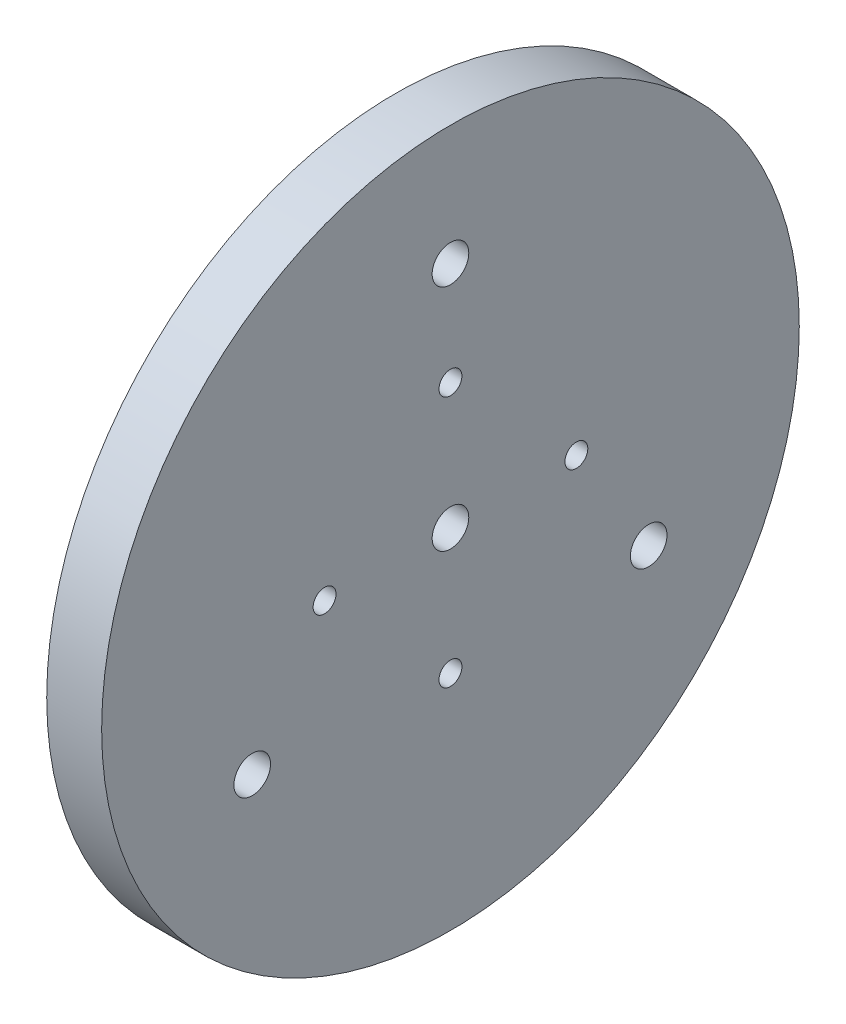
ISO-10303-21;
HEADER;
FILE_DESCRIPTION(('STEP AP214'),'2;1');
FILE_NAME('part.step','',(''),(''),'','','');
FILE_SCHEMA(('AUTOMOTIVE_DESIGN { 1 0 10303 214 1 1 1 1 }'));
ENDSEC;
DATA;
#1=APPLICATION_CONTEXT('core data for automotive mechanical design processes');
#2=APPLICATION_PROTOCOL_DEFINITION('international standard','automotive_design',2000,#1);
#3=PRODUCT_CONTEXT('',#1,'mechanical');
#4=PRODUCT('Part','Part','',(#3));
#5=PRODUCT_RELATED_PRODUCT_CATEGORY('part','',(#4));
#6=PRODUCT_DEFINITION_FORMATION('','',#4);
#7=PRODUCT_DEFINITION_CONTEXT('part definition',#1,'design');
#8=PRODUCT_DEFINITION('design','',#6,#7);
#9=PRODUCT_DEFINITION_SHAPE('','',#8);
#10=(LENGTH_UNIT() NAMED_UNIT(*) SI_UNIT(.MILLI.,.METRE.));
#11=(NAMED_UNIT(*) PLANE_ANGLE_UNIT() SI_UNIT($,.RADIAN.));
#12=(NAMED_UNIT(*) SI_UNIT($,.STERADIAN.) SOLID_ANGLE_UNIT());
#13=UNCERTAINTY_MEASURE_WITH_UNIT(LENGTH_MEASURE(1.E-05),#10,'distance_accuracy_value','');
#14=(GEOMETRIC_REPRESENTATION_CONTEXT(3) GLOBAL_UNCERTAINTY_ASSIGNED_CONTEXT((#13)) GLOBAL_UNIT_ASSIGNED_CONTEXT((#10,
#11,#12)) REPRESENTATION_CONTEXT('',''));
#15=CARTESIAN_POINT('',(0.,0.,0.));
#16=DIRECTION('',(0.,0.,1.));
#17=DIRECTION('',(1.,0.,0.));
#18=AXIS2_PLACEMENT_3D('',#15,#16,#17);
#19=CARTESIAN_POINT('',(12.,0.,0.));
#20=DIRECTION('',(1.,0.,0.));
#21=DIRECTION('',(0.,0.,-1.));
#22=AXIS2_PLACEMENT_3D('',#19,#20,#21);
#23=PLANE('',#22);
#24=CARTESIAN_POINT('',(12.,-24.9999999999981,-43.3012701892251));
#25=DIRECTION('',(1.,0.,0.));
#26=DIRECTION('',(0.,0.,-1.));
#27=AXIS2_PLACEMENT_3D('',#24,#25,#26);
#28=CIRCLE('',#27,4.00000000000277);
#29=CARTESIAN_POINT('',(12.,-24.9999999999981,-47.3012701892279));
#30=VERTEX_POINT('',#29);
#31=EDGE_CURVE('E80',#30,#30,#28,.T.);
#32=ORIENTED_EDGE('',*,*,#31,.F.);
#33=EDGE_LOOP('',(#32));
#34=FACE_BOUND('',#33,.T.);
#35=CARTESIAN_POINT('',(12.,0.,27.4999999999992));
#36=DIRECTION('',(1.,0.,0.));
#37=DIRECTION('',(0.,0.,-1.));
#38=AXIS2_PLACEMENT_3D('',#35,#36,#37);
#39=CIRCLE('',#38,2.5);
#40=CARTESIAN_POINT('',(12.,0.,24.9999999999992));
#41=VERTEX_POINT('',#40);
#42=EDGE_CURVE('E68',#41,#41,#39,.T.);
#43=ORIENTED_EDGE('',*,*,#42,.F.);
#44=EDGE_LOOP('',(#43));
#45=FACE_BOUND('',#44,.T.);
#46=CARTESIAN_POINT('',(12.,1.56125112837913E-12,-27.5000000000008));
#47=DIRECTION('',(1.,0.,0.));
#48=DIRECTION('',(0.,0.,-1.));
#49=AXIS2_PLACEMENT_3D('',#46,#47,#48);
#50=CIRCLE('',#49,2.5);
#51=CARTESIAN_POINT('',(12.,1.56125112837913E-12,-30.0000000000008));
#52=VERTEX_POINT('',#51);
#53=EDGE_CURVE('E56',#52,#52,#50,.T.);
#54=ORIENTED_EDGE('',*,*,#53,.F.);
#55=EDGE_LOOP('',(#54));
#56=FACE_BOUND('',#55,.T.);
#57=CARTESIAN_POINT('',(12.,27.5000000000008,0.));
#58=DIRECTION('',(1.,0.,0.));
#59=DIRECTION('',(0.,0.,-1.));
#60=AXIS2_PLACEMENT_3D('',#57,#58,#59);
#61=CIRCLE('',#60,2.5);
#62=CARTESIAN_POINT('',(12.,27.5000000000008,-2.50000000000001));
#63=VERTEX_POINT('',#62);
#64=EDGE_CURVE('E45',#63,#63,#61,.T.);
#65=ORIENTED_EDGE('',*,*,#64,.F.);
#66=EDGE_LOOP('',(#65));
#67=FACE_BOUND('',#66,.T.);
#68=CARTESIAN_POINT('',(12.,0.,0.));
#69=DIRECTION('',(1.,0.,0.));
#70=DIRECTION('',(0.,0.,-1.));
#71=AXIS2_PLACEMENT_3D('',#68,#69,#70);
#72=CIRCLE('',#71,76.2);
#73=CARTESIAN_POINT('',(12.,0.,-76.2));
#74=VERTEX_POINT('',#73);
#75=EDGE_CURVE('E10',#74,#74,#72,.T.);
#76=ORIENTED_EDGE('',*,*,#75,.T.);
#77=EDGE_LOOP('',(#76));
#78=FACE_BOUND('',#77,.T.);
#79=CARTESIAN_POINT('',(12.,50.,0.));
#80=DIRECTION('',(1.,0.,0.));
#81=DIRECTION('',(0.,0.,-1.));
#82=AXIS2_PLACEMENT_3D('',#79,#80,#81);
#83=CIRCLE('',#82,4.);
#84=CARTESIAN_POINT('',(12.,50.,-4.00000000000001));
#85=VERTEX_POINT('',#84);
#86=EDGE_CURVE('E50',#85,#85,#83,.T.);
#87=ORIENTED_EDGE('',*,*,#86,.F.);
#88=EDGE_LOOP('',(#87));
#89=FACE_BOUND('',#88,.T.);
#90=CARTESIAN_POINT('',(12.,-27.4999999999992,-1.55715009788833E-12));
#91=DIRECTION('',(1.,0.,0.));
#92=DIRECTION('',(0.,0.,-1.));
#93=AXIS2_PLACEMENT_3D('',#90,#91,#92);
#94=CIRCLE('',#93,2.5);
#95=CARTESIAN_POINT('',(12.,-27.4999999999992,-2.50000000000156));
#96=VERTEX_POINT('',#95);
#97=EDGE_CURVE('E62',#96,#96,#94,.T.);
#98=ORIENTED_EDGE('',*,*,#97,.F.);
#99=EDGE_LOOP('',(#98));
#100=FACE_BOUND('',#99,.T.);
#101=CARTESIAN_POINT('',(12.,0.,0.));
#102=DIRECTION('',(1.,0.,0.));
#103=DIRECTION('',(0.,0.,-1.));
#104=AXIS2_PLACEMENT_3D('',#101,#102,#103);
#105=CIRCLE('',#104,4.);
#106=CARTESIAN_POINT('',(12.,0.,-4.));
#107=VERTEX_POINT('',#106);
#108=EDGE_CURVE('E74',#107,#107,#105,.T.);
#109=ORIENTED_EDGE('',*,*,#108,.F.);
#110=EDGE_LOOP('',(#109));
#111=FACE_BOUND('',#110,.T.);
#112=CARTESIAN_POINT('',(12.,-25.0000000000019,43.3012701892187));
#113=DIRECTION('',(1.,0.,0.));
#114=DIRECTION('',(0.,0.,-1.));
#115=AXIS2_PLACEMENT_3D('',#112,#113,#114);
#116=CIRCLE('',#115,4.00000000000407);
#117=CARTESIAN_POINT('',(12.,-25.0000000000019,39.3012701892146));
#118=VERTEX_POINT('',#117);
#119=EDGE_CURVE('E86',#118,#118,#116,.T.);
#120=ORIENTED_EDGE('',*,*,#119,.F.);
#121=EDGE_LOOP('',(#120));
#122=FACE_BOUND('',#121,.T.);
#123=ADVANCED_FACE('F34',(#34,#45,#56,#67,#78,#89,#100,#111,#122),#23,.T.);
#124=CARTESIAN_POINT('',(0.,0.,0.));
#125=DIRECTION('',(1.,0.,0.));
#126=DIRECTION('',(0.,0.,-1.));
#127=AXIS2_PLACEMENT_3D('',#124,#125,#126);
#128=PLANE('',#127);
#129=CARTESIAN_POINT('',(0.,0.,0.));
#130=DIRECTION('',(1.,0.,0.));
#131=DIRECTION('',(0.,0.,-1.));
#132=AXIS2_PLACEMENT_3D('',#129,#130,#131);
#133=CIRCLE('',#132,76.2);
#134=CARTESIAN_POINT('',(0.,0.,-76.2));
#135=VERTEX_POINT('',#134);
#136=EDGE_CURVE('E38',#135,#135,#133,.T.);
#137=ORIENTED_EDGE('',*,*,#136,.F.);
#138=EDGE_LOOP('',(#137));
#139=FACE_BOUND('',#138,.T.);
#140=CARTESIAN_POINT('',(0.,27.5000000000008,0.));
#141=DIRECTION('',(1.,0.,0.));
#142=DIRECTION('',(0.,0.,-1.));
#143=AXIS2_PLACEMENT_3D('',#140,#141,#142);
#144=CIRCLE('',#143,2.5);
#145=CARTESIAN_POINT('',(0.,27.5000000000008,-2.50000000000001));
#146=VERTEX_POINT('',#145);
#147=EDGE_CURVE('E47',#146,#146,#144,.T.);
#148=ORIENTED_EDGE('',*,*,#147,.T.);
#149=EDGE_LOOP('',(#148));
#150=FACE_BOUND('',#149,.T.);
#151=CARTESIAN_POINT('',(0.,50.,0.));
#152=DIRECTION('',(1.,0.,0.));
#153=DIRECTION('',(0.,0.,-1.));
#154=AXIS2_PLACEMENT_3D('',#151,#152,#153);
#155=CIRCLE('',#154,4.);
#156=CARTESIAN_POINT('',(0.,50.,-4.00000000000001));
#157=VERTEX_POINT('',#156);
#158=EDGE_CURVE('E53',#157,#157,#155,.T.);
#159=ORIENTED_EDGE('',*,*,#158,.T.);
#160=EDGE_LOOP('',(#159));
#161=FACE_BOUND('',#160,.T.);
#162=CARTESIAN_POINT('',(0.,1.56125112837913E-12,-27.5000000000008));
#163=DIRECTION('',(1.,0.,0.));
#164=DIRECTION('',(0.,0.,-1.));
#165=AXIS2_PLACEMENT_3D('',#162,#163,#164);
#166=CIRCLE('',#165,2.5);
#167=CARTESIAN_POINT('',(0.,1.56125112837913E-12,-30.0000000000008));
#168=VERTEX_POINT('',#167);
#169=EDGE_CURVE('E59',#168,#168,#166,.T.);
#170=ORIENTED_EDGE('',*,*,#169,.T.);
#171=EDGE_LOOP('',(#170));
#172=FACE_BOUND('',#171,.T.);
#173=CARTESIAN_POINT('',(0.,-27.4999999999992,-1.55715009788833E-12));
#174=DIRECTION('',(1.,0.,0.));
#175=DIRECTION('',(0.,0.,-1.));
#176=AXIS2_PLACEMENT_3D('',#173,#174,#175);
#177=CIRCLE('',#176,2.5);
#178=CARTESIAN_POINT('',(0.,-27.4999999999992,-2.50000000000156));
#179=VERTEX_POINT('',#178);
#180=EDGE_CURVE('E65',#179,#179,#177,.T.);
#181=ORIENTED_EDGE('',*,*,#180,.T.);
#182=EDGE_LOOP('',(#181));
#183=FACE_BOUND('',#182,.T.);
#184=CARTESIAN_POINT('',(0.,0.,27.4999999999992));
#185=DIRECTION('',(1.,0.,0.));
#186=DIRECTION('',(0.,0.,-1.));
#187=AXIS2_PLACEMENT_3D('',#184,#185,#186);
#188=CIRCLE('',#187,2.5);
#189=CARTESIAN_POINT('',(0.,0.,24.9999999999992));
#190=VERTEX_POINT('',#189);
#191=EDGE_CURVE('E71',#190,#190,#188,.T.);
#192=ORIENTED_EDGE('',*,*,#191,.T.);
#193=EDGE_LOOP('',(#192));
#194=FACE_BOUND('',#193,.T.);
#195=CARTESIAN_POINT('',(0.,0.,0.));
#196=DIRECTION('',(1.,0.,0.));
#197=DIRECTION('',(0.,0.,-1.));
#198=AXIS2_PLACEMENT_3D('',#195,#196,#197);
#199=CIRCLE('',#198,4.);
#200=CARTESIAN_POINT('',(0.,0.,-4.));
#201=VERTEX_POINT('',#200);
#202=EDGE_CURVE('E77',#201,#201,#199,.T.);
#203=ORIENTED_EDGE('',*,*,#202,.T.);
#204=EDGE_LOOP('',(#203));
#205=FACE_BOUND('',#204,.T.);
#206=CARTESIAN_POINT('',(0.,-24.9999999999981,-43.3012701892251));
#207=DIRECTION('',(1.,0.,0.));
#208=DIRECTION('',(0.,0.,-1.));
#209=AXIS2_PLACEMENT_3D('',#206,#207,#208);
#210=CIRCLE('',#209,4.00000000000277);
#211=CARTESIAN_POINT('',(0.,-24.9999999999981,-47.3012701892279));
#212=VERTEX_POINT('',#211);
#213=EDGE_CURVE('E83',#212,#212,#210,.T.);
#214=ORIENTED_EDGE('',*,*,#213,.T.);
#215=EDGE_LOOP('',(#214));
#216=FACE_BOUND('',#215,.T.);
#217=CARTESIAN_POINT('',(0.,-25.0000000000019,43.3012701892187));
#218=DIRECTION('',(1.,0.,0.));
#219=DIRECTION('',(0.,0.,-1.));
#220=AXIS2_PLACEMENT_3D('',#217,#218,#219);
#221=CIRCLE('',#220,4.00000000000407);
#222=CARTESIAN_POINT('',(0.,-25.0000000000019,39.3012701892146));
#223=VERTEX_POINT('',#222);
#224=EDGE_CURVE('E89',#223,#223,#221,.T.);
#225=ORIENTED_EDGE('',*,*,#224,.T.);
#226=EDGE_LOOP('',(#225));
#227=FACE_BOUND('',#226,.T.);
#228=ADVANCED_FACE('F99',(#139,#150,#161,#172,#183,#194,#205,#216,#227),#128,.F.);
#229=CARTESIAN_POINT('',(12.,0.,0.));
#230=DIRECTION('',(-1.,0.,0.));
#231=DIRECTION('',(0.,0.,1.));
#232=AXIS2_PLACEMENT_3D('',#229,#230,#231);
#233=CYLINDRICAL_SURFACE('',#232,76.2);
#234=ORIENTED_EDGE('',*,*,#75,.F.);
#235=EDGE_LOOP('',(#234));
#236=FACE_BOUND('',#235,.T.);
#237=ORIENTED_EDGE('',*,*,#136,.T.);
#238=EDGE_LOOP('',(#237));
#239=FACE_BOUND('',#238,.T.);
#240=ADVANCED_FACE('F36',(#236,#239),#233,.T.);
#241=CARTESIAN_POINT('',(12.,27.5000000000008,0.));
#242=DIRECTION('',(-1.,0.,0.));
#243=DIRECTION('',(0.,0.,1.));
#244=AXIS2_PLACEMENT_3D('',#241,#242,#243);
#245=CYLINDRICAL_SURFACE('',#244,2.5);
#246=ORIENTED_EDGE('',*,*,#64,.T.);
#247=EDGE_LOOP('',(#246));
#248=FACE_BOUND('',#247,.T.);
#249=ORIENTED_EDGE('',*,*,#147,.F.);
#250=EDGE_LOOP('',(#249));
#251=FACE_BOUND('',#250,.T.);
#252=ADVANCED_FACE('F109',(#248,#251),#245,.F.);
#253=CARTESIAN_POINT('',(12.,50.,0.));
#254=DIRECTION('',(-1.,0.,0.));
#255=DIRECTION('',(0.,0.,1.));
#256=AXIS2_PLACEMENT_3D('',#253,#254,#255);
#257=CYLINDRICAL_SURFACE('',#256,4.);
#258=ORIENTED_EDGE('',*,*,#86,.T.);
#259=EDGE_LOOP('',(#258));
#260=FACE_BOUND('',#259,.T.);
#261=ORIENTED_EDGE('',*,*,#158,.F.);
#262=EDGE_LOOP('',(#261));
#263=FACE_BOUND('',#262,.T.);
#264=ADVANCED_FACE('F112',(#260,#263),#257,.F.);
#265=CARTESIAN_POINT('',(12.,1.56125112837913E-12,-27.5000000000008));
#266=DIRECTION('',(-1.,0.,0.));
#267=DIRECTION('',(0.,0.,1.));
#268=AXIS2_PLACEMENT_3D('',#265,#266,#267);
#269=CYLINDRICAL_SURFACE('',#268,2.5);
#270=ORIENTED_EDGE('',*,*,#53,.T.);
#271=EDGE_LOOP('',(#270));
#272=FACE_BOUND('',#271,.T.);
#273=ORIENTED_EDGE('',*,*,#169,.F.);
#274=EDGE_LOOP('',(#273));
#275=FACE_BOUND('',#274,.T.);
#276=ADVANCED_FACE('F116',(#272,#275),#269,.F.);
#277=CARTESIAN_POINT('',(12.,-27.4999999999992,-1.55715009788833E-12));
#278=DIRECTION('',(-1.,0.,0.));
#279=DIRECTION('',(0.,0.,1.));
#280=AXIS2_PLACEMENT_3D('',#277,#278,#279);
#281=CYLINDRICAL_SURFACE('',#280,2.5);
#282=ORIENTED_EDGE('',*,*,#97,.T.);
#283=EDGE_LOOP('',(#282));
#284=FACE_BOUND('',#283,.T.);
#285=ORIENTED_EDGE('',*,*,#180,.F.);
#286=EDGE_LOOP('',(#285));
#287=FACE_BOUND('',#286,.T.);
#288=ADVANCED_FACE('F120',(#284,#287),#281,.F.);
#289=CARTESIAN_POINT('',(12.,0.,27.4999999999992));
#290=DIRECTION('',(-1.,0.,0.));
#291=DIRECTION('',(0.,0.,1.));
#292=AXIS2_PLACEMENT_3D('',#289,#290,#291);
#293=CYLINDRICAL_SURFACE('',#292,2.5);
#294=ORIENTED_EDGE('',*,*,#42,.T.);
#295=EDGE_LOOP('',(#294));
#296=FACE_BOUND('',#295,.T.);
#297=ORIENTED_EDGE('',*,*,#191,.F.);
#298=EDGE_LOOP('',(#297));
#299=FACE_BOUND('',#298,.T.);
#300=ADVANCED_FACE('F124',(#296,#299),#293,.F.);
#301=CARTESIAN_POINT('',(12.,0.,0.));
#302=DIRECTION('',(-1.,0.,0.));
#303=DIRECTION('',(0.,0.,1.));
#304=AXIS2_PLACEMENT_3D('',#301,#302,#303);
#305=CYLINDRICAL_SURFACE('',#304,4.);
#306=ORIENTED_EDGE('',*,*,#108,.T.);
#307=EDGE_LOOP('',(#306));
#308=FACE_BOUND('',#307,.T.);
#309=ORIENTED_EDGE('',*,*,#202,.F.);
#310=EDGE_LOOP('',(#309));
#311=FACE_BOUND('',#310,.T.);
#312=ADVANCED_FACE('F128',(#308,#311),#305,.F.);
#313=CARTESIAN_POINT('',(12.,-24.9999999999981,-43.3012701892251));
#314=DIRECTION('',(-1.,0.,0.));
#315=DIRECTION('',(0.,0.,1.));
#316=AXIS2_PLACEMENT_3D('',#313,#314,#315);
#317=CYLINDRICAL_SURFACE('',#316,4.00000000000277);
#318=ORIENTED_EDGE('',*,*,#31,.T.);
#319=EDGE_LOOP('',(#318));
#320=FACE_BOUND('',#319,.T.);
#321=ORIENTED_EDGE('',*,*,#213,.F.);
#322=EDGE_LOOP('',(#321));
#323=FACE_BOUND('',#322,.T.);
#324=ADVANCED_FACE('F132',(#320,#323),#317,.F.);
#325=CARTESIAN_POINT('',(12.,-25.0000000000019,43.3012701892187));
#326=DIRECTION('',(-1.,0.,0.));
#327=DIRECTION('',(0.,0.,1.));
#328=AXIS2_PLACEMENT_3D('',#325,#326,#327);
#329=CYLINDRICAL_SURFACE('',#328,4.00000000000407);
#330=ORIENTED_EDGE('',*,*,#119,.T.);
#331=EDGE_LOOP('',(#330));
#332=FACE_BOUND('',#331,.T.);
#333=ORIENTED_EDGE('',*,*,#224,.F.);
#334=EDGE_LOOP('',(#333));
#335=FACE_BOUND('',#334,.T.);
#336=ADVANCED_FACE('F95',(#332,#335),#329,.F.);
#337=CLOSED_SHELL('',(#123,#228,#240,#252,#264,#276,#288,#300,#312,#324,#336));
#338=MANIFOLD_SOLID_BREP('B2',#337);
#339=ADVANCED_BREP_SHAPE_REPRESENTATION('',(#18,#338),#14);
#340=SHAPE_DEFINITION_REPRESENTATION(#9,#339);
ENDSEC;
END-ISO-10303-21;
